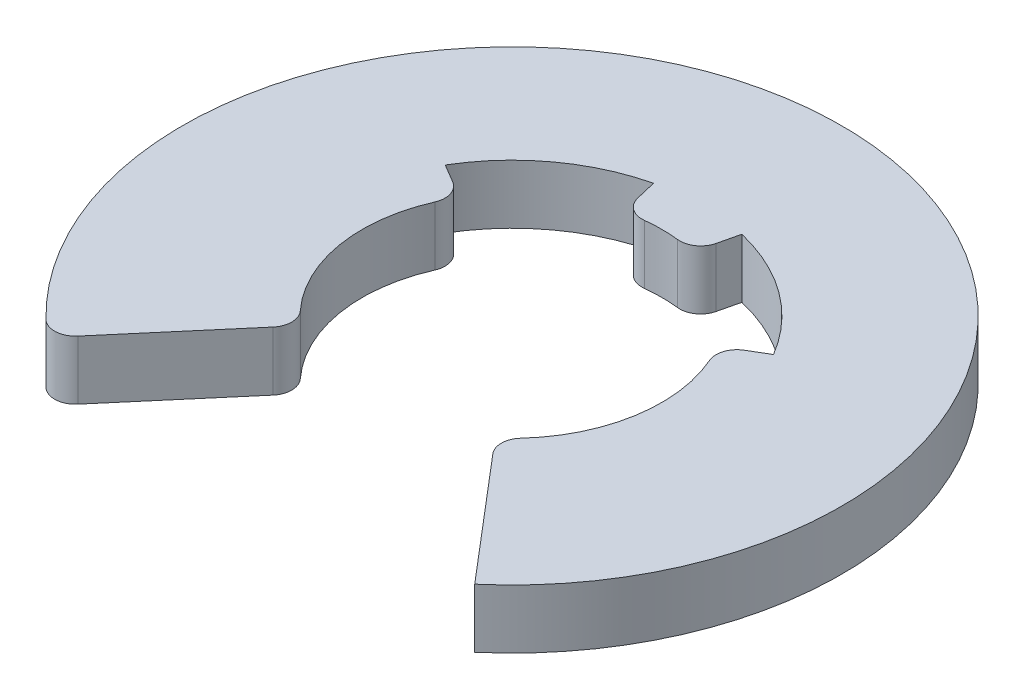
ISO-10303-21;
HEADER;
FILE_DESCRIPTION(('STEP AP214'),'2;1');
FILE_NAME('part.step','',(''),(''),'','','');
FILE_SCHEMA(('AUTOMOTIVE_DESIGN { 1 0 10303 214 1 1 1 1 }'));
ENDSEC;
DATA;
#1=APPLICATION_CONTEXT('core data for automotive mechanical design processes');
#2=APPLICATION_PROTOCOL_DEFINITION('international standard','automotive_design',2000,#1);
#3=PRODUCT_CONTEXT('',#1,'mechanical');
#4=PRODUCT('Part','Part','',(#3));
#5=PRODUCT_RELATED_PRODUCT_CATEGORY('part','',(#4));
#6=PRODUCT_DEFINITION_FORMATION('','',#4);
#7=PRODUCT_DEFINITION_CONTEXT('part definition',#1,'design');
#8=PRODUCT_DEFINITION('design','',#6,#7);
#9=PRODUCT_DEFINITION_SHAPE('','',#8);
#10=(LENGTH_UNIT() NAMED_UNIT(*) SI_UNIT(.MILLI.,.METRE.));
#11=(NAMED_UNIT(*) PLANE_ANGLE_UNIT() SI_UNIT($,.RADIAN.));
#12=(NAMED_UNIT(*) SI_UNIT($,.STERADIAN.) SOLID_ANGLE_UNIT());
#13=UNCERTAINTY_MEASURE_WITH_UNIT(LENGTH_MEASURE(1.E-05),#10,'distance_accuracy_value','');
#14=(GEOMETRIC_REPRESENTATION_CONTEXT(3) GLOBAL_UNCERTAINTY_ASSIGNED_CONTEXT((#13)) GLOBAL_UNIT_ASSIGNED_CONTEXT((#10,
#11,#12)) REPRESENTATION_CONTEXT('',''));
#15=CARTESIAN_POINT('',(0.,0.,0.));
#16=DIRECTION('',(0.,0.,1.));
#17=DIRECTION('',(1.,0.,0.));
#18=AXIS2_PLACEMENT_3D('',#15,#16,#17);
#19=CARTESIAN_POINT('',(0.,0.2125,0.));
#20=DIRECTION('',(0.,-1.,0.));
#21=DIRECTION('',(0.,0.,-1.));
#22=AXIS2_PLACEMENT_3D('',#19,#20,#21);
#23=CYLINDRICAL_SURFACE('',#22,1.375);
#24=CARTESIAN_POINT('',(0.,-0.2125,0.));
#25=DIRECTION('',(0.,-1.,0.));
#26=DIRECTION('',(0.,0.,1.));
#27=AXIS2_PLACEMENT_3D('',#24,#25,#26);
#28=CIRCLE('',#27,1.375);
#29=CARTESIAN_POINT('',(-1.18284059152493,-0.2125,-0.70107997763518));
#30=VERTEX_POINT('',#29);
#31=CARTESIAN_POINT('',(-0.318287037037037,-0.2125,-1.33765405170925));
#32=VERTEX_POINT('',#31);
#33=EDGE_CURVE('E200',#30,#32,#28,.T.);
#34=ORIENTED_EDGE('',*,*,#33,.T.);
#35=DIRECTION('',(0.,-1.,0.));
#36=VECTOR('',#35,1.);
#37=CARTESIAN_POINT('',(-0.318287037037037,0.2125,-1.33765405170925));
#38=LINE('',#37,#36);
#39=CARTESIAN_POINT('',(-0.318287037037037,0.2125,-1.33765405170925));
#40=VERTEX_POINT('',#39);
#41=EDGE_CURVE('E180',#40,#32,#38,.T.);
#42=ORIENTED_EDGE('',*,*,#41,.F.);
#43=CARTESIAN_POINT('',(0.,0.2125,0.));
#44=DIRECTION('',(0.,-1.,0.));
#45=DIRECTION('',(0.,0.,1.));
#46=AXIS2_PLACEMENT_3D('',#43,#44,#45);
#47=CIRCLE('',#46,1.375);
#48=CARTESIAN_POINT('',(-1.18284059152493,0.2125,-0.70107997763518));
#49=VERTEX_POINT('',#48);
#50=EDGE_CURVE('E187',#49,#40,#47,.T.);
#51=ORIENTED_EDGE('',*,*,#50,.F.);
#52=DIRECTION('',(0.,-1.,0.));
#53=VECTOR('',#52,1.);
#54=CARTESIAN_POINT('',(-1.18284059152493,0.2125,-0.70107997763518));
#55=LINE('',#54,#53);
#56=EDGE_CURVE('E329',#49,#30,#55,.T.);
#57=ORIENTED_EDGE('',*,*,#56,.T.);
#58=EDGE_LOOP('',(#34,#42,#51,#57));
#59=FACE_BOUND('',#58,.T.);
#60=ADVANCED_FACE('F42',(#59),#23,.F.);
#61=CARTESIAN_POINT('',(-0.318287037037037,0.2125,-1.33765405170925));
#62=DIRECTION('',(0.972839310334003,0.,-0.231481481481482));
#63=DIRECTION('',(-0.231481481481482,0.,-0.972839310334003));
#64=AXIS2_PLACEMENT_3D('',#61,#62,#63);
#65=PLANE('',#64);
#66=DIRECTION('',(0.231481481481482,0.,0.972839310334003));
#67=VECTOR('',#66,1.);
#68=CARTESIAN_POINT('',(-0.318287037037037,-0.2125,-1.33765405170925));
#69=LINE('',#68,#67);
#70=CARTESIAN_POINT('',(-0.282597082630219,-0.2125,-1.18766110018342));
#71=VERTEX_POINT('',#70);
#72=EDGE_CURVE('E413',#32,#71,#69,.T.);
#73=ORIENTED_EDGE('',*,*,#72,.T.);
#74=DIRECTION('',(0.,-1.,0.));
#75=VECTOR('',#74,1.);
#76=CARTESIAN_POINT('',(-0.282597082630219,0.2125,-1.18766110018342));
#77=LINE('',#76,#75);
#78=CARTESIAN_POINT('',(-0.282597082630219,0.2125,-1.18766110018342));
#79=VERTEX_POINT('',#78);
#80=EDGE_CURVE('E183',#71,#79,#77,.F.);
#81=ORIENTED_EDGE('',*,*,#80,.T.);
#82=DIRECTION('',(0.231481481481482,0.,0.972839310334003));
#83=VECTOR('',#82,1.);
#84=CARTESIAN_POINT('',(-0.318287037037037,0.2125,-1.33765405170925));
#85=LINE('',#84,#83);
#86=EDGE_CURVE('E175',#40,#79,#85,.T.);
#87=ORIENTED_EDGE('',*,*,#86,.F.);
#88=ORIENTED_EDGE('',*,*,#41,.T.);
#89=EDGE_LOOP('',(#73,#81,#87,#88));
#90=FACE_BOUND('',#89,.T.);
#91=ADVANCED_FACE('F178',(#90),#65,.F.);
#92=CARTESIAN_POINT('',(0.,0.2125,0.));
#93=DIRECTION('',(0.,-1.,0.));
#94=DIRECTION('',(0.,0.,-1.));
#95=AXIS2_PLACEMENT_3D('',#92,#93,#94);
#96=CYLINDRICAL_SURFACE('',#95,1.08);
#97=CARTESIAN_POINT('',(0.,-0.2125,0.));
#98=DIRECTION('',(0.,-1.,0.));
#99=DIRECTION('',(0.,0.,1.));
#100=AXIS2_PLACEMENT_3D('',#97,#98,#99);
#101=CIRCLE('',#100,1.08);
#102=CARTESIAN_POINT('',(-0.12000396826547,-0.2125,-1.0733121855269));
#103=VERTEX_POINT('',#102);
#104=CARTESIAN_POINT('',(0.12000396826547,-0.2125,-1.0733121855269));
#105=VERTEX_POINT('',#104);
#106=EDGE_CURVE('E418',#103,#105,#101,.T.);
#107=ORIENTED_EDGE('',*,*,#106,.T.);
#108=DIRECTION('',(0.,-1.,0.));
#109=VECTOR('',#108,1.);
#110=CARTESIAN_POINT('',(0.12000396826547,0.2125,-1.0733121855269));
#111=LINE('',#110,#109);
#112=CARTESIAN_POINT('',(0.12000396826547,0.2125,-1.0733121855269));
#113=VERTEX_POINT('',#112);
#114=EDGE_CURVE('E274',#105,#113,#111,.F.);
#115=ORIENTED_EDGE('',*,*,#114,.T.);
#116=CARTESIAN_POINT('',(0.,0.2125,0.));
#117=DIRECTION('',(0.,-1.,0.));
#118=DIRECTION('',(0.,0.,1.));
#119=AXIS2_PLACEMENT_3D('',#116,#117,#118);
#120=CIRCLE('',#119,1.08);
#121=CARTESIAN_POINT('',(-0.12000396826547,0.2125,-1.0733121855269));
#122=VERTEX_POINT('',#121);
#123=EDGE_CURVE('E186',#122,#113,#120,.T.);
#124=ORIENTED_EDGE('',*,*,#123,.F.);
#125=DIRECTION('',(0.,-1.,0.));
#126=VECTOR('',#125,1.);
#127=CARTESIAN_POINT('',(-0.12000396826547,0.2125,-1.0733121855269));
#128=LINE('',#127,#126);
#129=EDGE_CURVE('E270',#122,#103,#128,.T.);
#130=ORIENTED_EDGE('',*,*,#129,.T.);
#131=EDGE_LOOP('',(#107,#115,#124,#130));
#132=FACE_BOUND('',#131,.T.);
#133=ADVANCED_FACE('F386',(#132),#96,.F.);
#134=CARTESIAN_POINT('',(0.318287037037037,0.2125,-1.33765405170925));
#135=DIRECTION('',(-0.972839310334003,0.,-0.231481481481482));
#136=DIRECTION('',(-0.231481481481482,0.,0.972839310334003));
#137=AXIS2_PLACEMENT_3D('',#134,#135,#136);
#138=PLANE('',#137);
#139=DIRECTION('',(0.231481481481482,0.,-0.972839310334003));
#140=VECTOR('',#139,1.);
#141=CARTESIAN_POINT('',(0.318287037037037,0.2125,-1.33765405170925));
#142=LINE('',#141,#140);
#143=CARTESIAN_POINT('',(0.282597082630219,0.2125,-1.18766110018342));
#144=VERTEX_POINT('',#143);
#145=CARTESIAN_POINT('',(0.318287037037037,0.2125,-1.33765405170925));
#146=VERTEX_POINT('',#145);
#147=EDGE_CURVE('E433',#144,#146,#142,.T.);
#148=ORIENTED_EDGE('',*,*,#147,.F.);
#149=DIRECTION('',(0.,-1.,0.));
#150=VECTOR('',#149,1.);
#151=CARTESIAN_POINT('',(0.282597082630219,0.2125,-1.18766110018342));
#152=LINE('',#151,#150);
#153=CARTESIAN_POINT('',(0.282597082630219,-0.2125,-1.18766110018342));
#154=VERTEX_POINT('',#153);
#155=EDGE_CURVE('E266',#144,#154,#152,.T.);
#156=ORIENTED_EDGE('',*,*,#155,.T.);
#157=DIRECTION('',(0.231481481481482,0.,-0.972839310334003));
#158=VECTOR('',#157,1.);
#159=CARTESIAN_POINT('',(0.318287037037037,-0.2125,-1.33765405170925));
#160=LINE('',#159,#158);
#161=CARTESIAN_POINT('',(0.318287037037037,-0.2125,-1.33765405170925));
#162=VERTEX_POINT('',#161);
#163=EDGE_CURVE('E361',#154,#162,#160,.T.);
#164=ORIENTED_EDGE('',*,*,#163,.T.);
#165=DIRECTION('',(0.,-1.,0.));
#166=VECTOR('',#165,1.);
#167=CARTESIAN_POINT('',(0.318287037037037,0.2125,-1.33765405170925));
#168=LINE('',#167,#166);
#169=EDGE_CURVE('E203',#146,#162,#168,.T.);
#170=ORIENTED_EDGE('',*,*,#169,.F.);
#171=EDGE_LOOP('',(#148,#156,#164,#170));
#172=FACE_BOUND('',#171,.T.);
#173=ADVANCED_FACE('F429',(#172),#138,.F.);
#174=CARTESIAN_POINT('',(0.,0.2125,0.));
#175=DIRECTION('',(0.,-1.,0.));
#176=DIRECTION('',(0.,0.,-1.));
#177=AXIS2_PLACEMENT_3D('',#174,#175,#176);
#178=CYLINDRICAL_SURFACE('',#177,1.375);
#179=CARTESIAN_POINT('',(0.,-0.2125,0.));
#180=DIRECTION('',(0.,-1.,0.));
#181=DIRECTION('',(0.,0.,1.));
#182=AXIS2_PLACEMENT_3D('',#179,#180,#181);
#183=CIRCLE('',#182,1.375);
#184=CARTESIAN_POINT('',(1.18284059152493,-0.2125,-0.70107997763518));
#185=VERTEX_POINT('',#184);
#186=EDGE_CURVE('E351',#162,#185,#183,.T.);
#187=ORIENTED_EDGE('',*,*,#186,.T.);
#188=DIRECTION('',(0.,-1.,0.));
#189=VECTOR('',#188,1.);
#190=CARTESIAN_POINT('',(1.18284059152493,0.2125,-0.70107997763518));
#191=LINE('',#190,#189);
#192=CARTESIAN_POINT('',(1.18284059152493,0.2125,-0.70107997763518));
#193=VERTEX_POINT('',#192);
#194=EDGE_CURVE('E213',#193,#185,#191,.T.);
#195=ORIENTED_EDGE('',*,*,#194,.F.);
#196=CARTESIAN_POINT('',(0.,0.2125,0.));
#197=DIRECTION('',(0.,-1.,0.));
#198=DIRECTION('',(0.,0.,1.));
#199=AXIS2_PLACEMENT_3D('',#196,#197,#198);
#200=CIRCLE('',#199,1.375);
#201=EDGE_CURVE('E432',#146,#193,#200,.T.);
#202=ORIENTED_EDGE('',*,*,#201,.F.);
#203=ORIENTED_EDGE('',*,*,#169,.T.);
#204=EDGE_LOOP('',(#187,#195,#202,#203));
#205=FACE_BOUND('',#204,.T.);
#206=ADVANCED_FACE('F431',(#205),#178,.F.);
#207=CARTESIAN_POINT('',(1.18284059152493,0.2125,-0.70107997763518));
#208=DIRECTION('',(0.509876347371041,0.,0.860247702927224));
#209=DIRECTION('',(0.860247702927224,0.,-0.509876347371041));
#210=AXIS2_PLACEMENT_3D('',#207,#208,#209);
#211=PLANE('',#210);
#212=DIRECTION('',(-0.860247702927224,0.,0.509876347371041));
#213=VECTOR('',#212,1.);
#214=CARTESIAN_POINT('',(1.18284059152493,-0.2125,-0.70107997763518));
#215=LINE('',#214,#213);
#216=CARTESIAN_POINT('',(1.05020708192603,-0.2125,-0.62246693492298));
#217=VERTEX_POINT('',#216);
#218=EDGE_CURVE('E343',#185,#217,#215,.T.);
#219=ORIENTED_EDGE('',*,*,#218,.T.);
#220=DIRECTION('',(0.,-1.,0.));
#221=VECTOR('',#220,1.);
#222=CARTESIAN_POINT('',(1.05020708192603,0.2125,-0.62246693492298));
#223=LINE('',#222,#221);
#224=CARTESIAN_POINT('',(1.05020708192603,0.2125,-0.62246693492298));
#225=VERTEX_POINT('',#224);
#226=EDGE_CURVE('E263',#217,#225,#223,.F.);
#227=ORIENTED_EDGE('',*,*,#226,.T.);
#228=DIRECTION('',(-0.860247702927224,0.,0.509876347371041));
#229=VECTOR('',#228,1.);
#230=CARTESIAN_POINT('',(1.18284059152493,0.2125,-0.70107997763518));
#231=LINE('',#230,#229);
#232=EDGE_CURVE('E346',#193,#225,#231,.T.);
#233=ORIENTED_EDGE('',*,*,#232,.F.);
#234=ORIENTED_EDGE('',*,*,#194,.T.);
#235=EDGE_LOOP('',(#219,#227,#233,#234));
#236=FACE_BOUND('',#235,.T.);
#237=ADVANCED_FACE('F342',(#236),#211,.F.);
#238=CARTESIAN_POINT('',(0.,0.2125,0.));
#239=DIRECTION('',(0.,-1.,0.));
#240=DIRECTION('',(0.,0.,-1.));
#241=AXIS2_PLACEMENT_3D('',#238,#239,#240);
#242=CYLINDRICAL_SURFACE('',#241,1.08);
#243=CARTESIAN_POINT('',(0.,-0.2125,0.));
#244=DIRECTION('',(0.,-1.,0.));
#245=DIRECTION('',(0.,0.,1.));
#246=AXIS2_PLACEMENT_3D('',#243,#244,#245);
#247=CIRCLE('',#246,1.08);
#248=CARTESIAN_POINT('',(0.989287493296116,-0.2125,-0.433255416132201));
#249=VERTEX_POINT('',#248);
#250=CARTESIAN_POINT('',(0.795072267515038,-0.2125,0.730930974462361));
#251=VERTEX_POINT('',#250);
#252=EDGE_CURVE('E354',#249,#251,#247,.T.);
#253=ORIENTED_EDGE('',*,*,#252,.T.);
#254=DIRECTION('',(0.,-1.,0.));
#255=VECTOR('',#254,1.);
#256=CARTESIAN_POINT('',(0.795072267515038,0.2125,0.730930974462361));
#257=LINE('',#256,#255);
#258=CARTESIAN_POINT('',(0.795072267515038,0.2125,0.730930974462361));
#259=VERTEX_POINT('',#258);
#260=EDGE_CURVE('E240',#251,#259,#257,.F.);
#261=ORIENTED_EDGE('',*,*,#260,.T.);
#262=CARTESIAN_POINT('',(0.,0.2125,0.));
#263=DIRECTION('',(0.,-1.,0.));
#264=DIRECTION('',(0.,0.,1.));
#265=AXIS2_PLACEMENT_3D('',#262,#263,#264);
#266=CIRCLE('',#265,1.08);
#267=CARTESIAN_POINT('',(0.989287493296116,0.2125,-0.433255416132201));
#268=VERTEX_POINT('',#267);
#269=EDGE_CURVE('E435',#268,#259,#266,.T.);
#270=ORIENTED_EDGE('',*,*,#269,.F.);
#271=DIRECTION('',(0.,-1.,0.));
#272=VECTOR('',#271,1.);
#273=CARTESIAN_POINT('',(0.989287493296116,0.2125,-0.433255416132201));
#274=LINE('',#273,#272);
#275=EDGE_CURVE('E236',#268,#249,#274,.T.);
#276=ORIENTED_EDGE('',*,*,#275,.T.);
#277=EDGE_LOOP('',(#253,#261,#270,#276));
#278=FACE_BOUND('',#277,.T.);
#279=ADVANCED_FACE('F455',(#278),#242,.F.);
#280=CARTESIAN_POINT('',(1.53935185185185,0.2125,1.8085963828893));
#281=DIRECTION('',(0.761514266479707,0.,-0.648148148148148));
#282=DIRECTION('',(-0.648148148148148,0.,-0.761514266479707));
#283=AXIS2_PLACEMENT_3D('',#280,#281,#282);
#284=PLANE('',#283);
#285=DIRECTION('',(0.648148148148148,0.,0.761514266479707));
#286=VECTOR('',#285,1.);
#287=CARTESIAN_POINT('',(1.53935185185185,0.2125,1.8085963828893));
#288=LINE('',#287,#286);
#289=CARTESIAN_POINT('',(0.791271831364614,0.2125,0.929671387582133));
#290=VERTEX_POINT('',#289);
#291=CARTESIAN_POINT('',(1.53935185185185,0.2125,1.8085963828893));
#292=VERTEX_POINT('',#291);
#293=EDGE_CURVE('E443',#290,#292,#288,.T.);
#294=ORIENTED_EDGE('',*,*,#293,.F.);
#295=DIRECTION('',(0.,-1.,0.));
#296=VECTOR('',#295,1.);
#297=CARTESIAN_POINT('',(0.791271831364614,0.2125,0.929671387582133));
#298=LINE('',#297,#296);
#299=CARTESIAN_POINT('',(0.791271831364614,-0.2125,0.929671387582133));
#300=VERTEX_POINT('',#299);
#301=EDGE_CURVE('E202',#290,#300,#298,.T.);
#302=ORIENTED_EDGE('',*,*,#301,.T.);
#303=DIRECTION('',(0.648148148148148,0.,0.761514266479707));
#304=VECTOR('',#303,1.);
#305=CARTESIAN_POINT('',(1.53935185185185,-0.2125,1.8085963828893));
#306=LINE('',#305,#304);
#307=CARTESIAN_POINT('',(1.53935185185185,-0.2125,1.8085963828893));
#308=VERTEX_POINT('',#307);
#309=EDGE_CURVE('E358',#300,#308,#306,.T.);
#310=ORIENTED_EDGE('',*,*,#309,.T.);
#311=DIRECTION('',(0.,-1.,0.));
#312=VECTOR('',#311,1.);
#313=CARTESIAN_POINT('',(1.53935185185185,0.2125,1.8085963828893));
#314=LINE('',#313,#312);
#315=EDGE_CURVE('E332',#292,#308,#314,.T.);
#316=ORIENTED_EDGE('',*,*,#315,.F.);
#317=EDGE_LOOP('',(#294,#302,#310,#316));
#318=FACE_BOUND('',#317,.T.);
#319=ADVANCED_FACE('F452',(#318),#284,.F.);
#320=CARTESIAN_POINT('',(0.,0.2125,0.));
#321=DIRECTION('',(0.,-1.,0.));
#322=DIRECTION('',(0.,0.,-1.));
#323=AXIS2_PLACEMENT_3D('',#320,#321,#322);
#324=CYLINDRICAL_SURFACE('',#323,2.375);
#325=CARTESIAN_POINT('',(0.,-0.2125,0.));
#326=DIRECTION('',(0.,1.,0.));
#327=DIRECTION('',(0.,0.,1.));
#328=AXIS2_PLACEMENT_3D('',#325,#326,#327);
#329=CIRCLE('',#328,2.375);
#330=CARTESIAN_POINT('',(-1.65777762897793,-0.2125,1.70070524573199));
#331=VERTEX_POINT('',#330);
#332=EDGE_CURVE('E325',#308,#331,#329,.T.);
#333=ORIENTED_EDGE('',*,*,#332,.T.);
#334=DIRECTION('',(0.,-1.,0.));
#335=VECTOR('',#334,1.);
#336=CARTESIAN_POINT('',(-1.65777762897793,0.2125,1.70070524573199));
#337=LINE('',#336,#335);
#338=CARTESIAN_POINT('',(-1.65777762897793,0.2125,1.70070524573199));
#339=VERTEX_POINT('',#338);
#340=EDGE_CURVE('E11',#331,#339,#337,.F.);
#341=ORIENTED_EDGE('',*,*,#340,.T.);
#342=CARTESIAN_POINT('',(0.,0.2125,0.));
#343=DIRECTION('',(0.,1.,0.));
#344=DIRECTION('',(0.,0.,1.));
#345=AXIS2_PLACEMENT_3D('',#342,#343,#344);
#346=CIRCLE('',#345,2.375);
#347=EDGE_CURVE('E309',#292,#339,#346,.T.);
#348=ORIENTED_EDGE('',*,*,#347,.F.);
#349=ORIENTED_EDGE('',*,*,#315,.T.);
#350=EDGE_LOOP('',(#333,#341,#348,#349));
#351=FACE_BOUND('',#350,.T.);
#352=ADVANCED_FACE('F372',(#351),#324,.T.);
#353=CARTESIAN_POINT('',(-1.53935185185185,0.2125,1.8085963828893));
#354=DIRECTION('',(-0.761514266479707,0.,-0.648148148148148));
#355=DIRECTION('',(-0.648148148148148,0.,0.761514266479707));
#356=AXIS2_PLACEMENT_3D('',#353,#354,#355);
#357=PLANE('',#356);
#358=DIRECTION('',(0.648148148148148,0.,-0.761514266479707));
#359=VECTOR('',#358,1.);
#360=CARTESIAN_POINT('',(-1.53935185185185,-0.2125,1.8085963828893));
#361=LINE('',#360,#359);
#362=CARTESIAN_POINT('',(-1.43884874401789,-0.2125,1.69051450506588));
#363=VERTEX_POINT('',#362);
#364=CARTESIAN_POINT('',(-0.791271831364614,-0.2125,0.929671387582133));
#365=VERTEX_POINT('',#364);
#366=EDGE_CURVE('E302',#363,#365,#361,.T.);
#367=ORIENTED_EDGE('',*,*,#366,.T.);
#368=DIRECTION('',(0.,-1.,0.));
#369=VECTOR('',#368,1.);
#370=CARTESIAN_POINT('',(-0.791271831364614,0.2125,0.929671387582133));
#371=LINE('',#370,#369);
#372=CARTESIAN_POINT('',(-0.791271831364614,0.2125,0.929671387582133));
#373=VERTEX_POINT('',#372);
#374=EDGE_CURVE('E51',#365,#373,#371,.F.);
#375=ORIENTED_EDGE('',*,*,#374,.T.);
#376=DIRECTION('',(0.648148148148148,0.,-0.761514266479707));
#377=VECTOR('',#376,1.);
#378=CARTESIAN_POINT('',(-1.53935185185185,0.2125,1.8085963828893));
#379=LINE('',#378,#377);
#380=CARTESIAN_POINT('',(-1.43884874401789,0.2125,1.69051450506588));
#381=VERTEX_POINT('',#380);
#382=EDGE_CURVE('E299',#381,#373,#379,.T.);
#383=ORIENTED_EDGE('',*,*,#382,.F.);
#384=DIRECTION('',(0.,-1.,0.));
#385=VECTOR('',#384,1.);
#386=CARTESIAN_POINT('',(-1.43884874401789,0.2125,1.69051450506588));
#387=LINE('',#386,#385);
#388=EDGE_CURVE('E289',#381,#363,#387,.T.);
#389=ORIENTED_EDGE('',*,*,#388,.T.);
#390=EDGE_LOOP('',(#367,#375,#383,#389));
#391=FACE_BOUND('',#390,.T.);
#392=ADVANCED_FACE('F298',(#391),#357,.F.);
#393=CARTESIAN_POINT('',(0.,0.2125,0.));
#394=DIRECTION('',(0.,-1.,0.));
#395=DIRECTION('',(0.,0.,-1.));
#396=AXIS2_PLACEMENT_3D('',#393,#394,#395);
#397=CYLINDRICAL_SURFACE('',#396,1.08);
#398=CARTESIAN_POINT('',(0.,-0.2125,0.));
#399=DIRECTION('',(0.,-1.,0.));
#400=DIRECTION('',(0.,0.,1.));
#401=AXIS2_PLACEMENT_3D('',#398,#399,#400);
#402=CIRCLE('',#401,1.08);
#403=CARTESIAN_POINT('',(-0.795072267515038,-0.2125,0.730930974462361));
#404=VERTEX_POINT('',#403);
#405=CARTESIAN_POINT('',(-0.989287493296116,-0.2125,-0.433255416132201));
#406=VERTEX_POINT('',#405);
#407=EDGE_CURVE('E315',#404,#406,#402,.T.);
#408=ORIENTED_EDGE('',*,*,#407,.T.);
#409=DIRECTION('',(0.,-1.,0.));
#410=VECTOR('',#409,1.);
#411=CARTESIAN_POINT('',(-0.989287493296116,0.2125,-0.433255416132201));
#412=LINE('',#411,#410);
#413=CARTESIAN_POINT('',(-0.989287493296116,0.2125,-0.433255416132201));
#414=VERTEX_POINT('',#413);
#415=EDGE_CURVE('E66',#406,#414,#412,.F.);
#416=ORIENTED_EDGE('',*,*,#415,.T.);
#417=CARTESIAN_POINT('',(0.,0.2125,0.));
#418=DIRECTION('',(0.,-1.,0.));
#419=DIRECTION('',(0.,0.,1.));
#420=AXIS2_PLACEMENT_3D('',#417,#418,#419);
#421=CIRCLE('',#420,1.08);
#422=CARTESIAN_POINT('',(-0.795072267515038,0.2125,0.730930974462361));
#423=VERTEX_POINT('',#422);
#424=EDGE_CURVE('E308',#423,#414,#421,.T.);
#425=ORIENTED_EDGE('',*,*,#424,.F.);
#426=DIRECTION('',(0.,-1.,0.));
#427=VECTOR('',#426,1.);
#428=CARTESIAN_POINT('',(-0.795072267515038,0.2125,0.730930974462361));
#429=LINE('',#428,#427);
#430=EDGE_CURVE('E283',#423,#404,#429,.T.);
#431=ORIENTED_EDGE('',*,*,#430,.T.);
#432=EDGE_LOOP('',(#408,#416,#425,#431));
#433=FACE_BOUND('',#432,.T.);
#434=ADVANCED_FACE('F314',(#433),#397,.F.);
#435=CARTESIAN_POINT('',(-1.18284059152493,0.2125,-0.70107997763518));
#436=DIRECTION('',(-0.509876347371041,0.,0.860247702927224));
#437=DIRECTION('',(0.860247702927224,0.,0.509876347371041));
#438=AXIS2_PLACEMENT_3D('',#435,#436,#437);
#439=PLANE('',#438);
#440=DIRECTION('',(-0.860247702927224,0.,-0.509876347371041));
#441=VECTOR('',#440,1.);
#442=CARTESIAN_POINT('',(-1.18284059152493,0.2125,-0.70107997763518));
#443=LINE('',#442,#441);
#444=CARTESIAN_POINT('',(-1.05020708192603,0.2125,-0.62246693492298));
#445=VERTEX_POINT('',#444);
#446=EDGE_CURVE('E192',#445,#49,#443,.T.);
#447=ORIENTED_EDGE('',*,*,#446,.F.);
#448=DIRECTION('',(0.,-1.,0.));
#449=VECTOR('',#448,1.);
#450=CARTESIAN_POINT('',(-1.05020708192603,0.2125,-0.62246693492298));
#451=LINE('',#450,#449);
#452=CARTESIAN_POINT('',(-1.05020708192603,-0.2125,-0.62246693492298));
#453=VERTEX_POINT('',#452);
#454=EDGE_CURVE('E279',#445,#453,#451,.T.);
#455=ORIENTED_EDGE('',*,*,#454,.T.);
#456=DIRECTION('',(-0.860247702927224,0.,-0.509876347371041));
#457=VECTOR('',#456,1.);
#458=CARTESIAN_POINT('',(-1.18284059152493,-0.2125,-0.70107997763518));
#459=LINE('',#458,#457);
#460=EDGE_CURVE('E197',#453,#30,#459,.T.);
#461=ORIENTED_EDGE('',*,*,#460,.T.);
#462=ORIENTED_EDGE('',*,*,#56,.F.);
#463=EDGE_LOOP('',(#447,#455,#461,#462));
#464=FACE_BOUND('',#463,.T.);
#465=ADVANCED_FACE('F412',(#464),#439,.F.);
#466=CARTESIAN_POINT('',(0.,0.2125,0.));
#467=DIRECTION('',(0.,1.,0.));
#468=DIRECTION('',(0.,0.,1.));
#469=AXIS2_PLACEMENT_3D('',#466,#467,#468);
#470=PLANE('',#469);
#471=ORIENTED_EDGE('',*,*,#269,.T.);
#472=CARTESIAN_POINT('',(0.90549897133657,0.2125,0.832449165359911));
#473=DIRECTION('',(0.,1.,0.));
#474=DIRECTION('',(0.,0.,1.));
#475=AXIS2_PLACEMENT_3D('',#472,#473,#474);
#476=CIRCLE('',#475,0.15);
#477=EDGE_CURVE('E260',#259,#290,#476,.T.);
#478=ORIENTED_EDGE('',*,*,#477,.T.);
#479=ORIENTED_EDGE('',*,*,#293,.T.);
#480=ORIENTED_EDGE('',*,*,#347,.T.);
#481=CARTESIAN_POINT('',(-1.55307588398985,0.2125,1.59329228284366));
#482=DIRECTION('',(0.,1.,0.));
#483=DIRECTION('',(0.,0.,1.));
#484=AXIS2_PLACEMENT_3D('',#481,#482,#483);
#485=CIRCLE('',#484,0.15);
#486=EDGE_CURVE('E243',#339,#381,#485,.T.);
#487=ORIENTED_EDGE('',*,*,#486,.T.);
#488=ORIENTED_EDGE('',*,*,#382,.T.);
#489=CARTESIAN_POINT('',(-0.90549897133657,0.2125,0.832449165359911));
#490=DIRECTION('',(0.,1.,0.));
#491=DIRECTION('',(0.,0.,1.));
#492=AXIS2_PLACEMENT_3D('',#489,#490,#491);
#493=CIRCLE('',#492,0.15);
#494=EDGE_CURVE('E246',#373,#423,#493,.T.);
#495=ORIENTED_EDGE('',*,*,#494,.T.);
#496=ORIENTED_EDGE('',*,*,#424,.T.);
#497=CARTESIAN_POINT('',(-1.12668853403169,0.2125,-0.493429779483896));
#498=DIRECTION('',(0.,1.,0.));
#499=DIRECTION('',(0.,0.,1.));
#500=AXIS2_PLACEMENT_3D('',#497,#498,#499);
#501=CIRCLE('',#500,0.15);
#502=EDGE_CURVE('E58',#414,#445,#501,.T.);
#503=ORIENTED_EDGE('',*,*,#502,.T.);
#504=ORIENTED_EDGE('',*,*,#446,.T.);
#505=ORIENTED_EDGE('',*,*,#50,.T.);
#506=ORIENTED_EDGE('',*,*,#86,.T.);
#507=CARTESIAN_POINT('',(-0.136671186080119,0.2125,-1.22238332240564));
#508=DIRECTION('',(0.,1.,0.));
#509=DIRECTION('',(0.,0.,1.));
#510=AXIS2_PLACEMENT_3D('',#507,#508,#509);
#511=CIRCLE('',#510,0.15);
#512=EDGE_CURVE('E251',#79,#122,#511,.T.);
#513=ORIENTED_EDGE('',*,*,#512,.T.);
#514=ORIENTED_EDGE('',*,*,#123,.T.);
#515=CARTESIAN_POINT('',(0.136671186080119,0.2125,-1.22238332240564));
#516=DIRECTION('',(0.,1.,0.));
#517=DIRECTION('',(0.,0.,1.));
#518=AXIS2_PLACEMENT_3D('',#515,#516,#517);
#519=CIRCLE('',#518,0.15);
#520=EDGE_CURVE('E254',#113,#144,#519,.T.);
#521=ORIENTED_EDGE('',*,*,#520,.T.);
#522=ORIENTED_EDGE('',*,*,#147,.T.);
#523=ORIENTED_EDGE('',*,*,#201,.T.);
#524=ORIENTED_EDGE('',*,*,#232,.T.);
#525=CARTESIAN_POINT('',(1.12668853403169,0.2125,-0.493429779483896));
#526=DIRECTION('',(0.,1.,0.));
#527=DIRECTION('',(0.,0.,1.));
#528=AXIS2_PLACEMENT_3D('',#525,#526,#527);
#529=CIRCLE('',#528,0.15);
#530=EDGE_CURVE('E257',#225,#268,#529,.T.);
#531=ORIENTED_EDGE('',*,*,#530,.T.);
#532=EDGE_LOOP('',(#471,#478,#479,#480,#487,#488,#495,#496,#503,#504,#505,#506,#513,#514,#521,
#522,#523,#524,#531));
#533=FACE_BOUND('',#532,.T.);
#534=ADVANCED_FACE('F191',(#533),#470,.T.);
#535=CARTESIAN_POINT('',(0.,-0.2125,0.));
#536=DIRECTION('',(0.,1.,0.));
#537=DIRECTION('',(0.,0.,1.));
#538=AXIS2_PLACEMENT_3D('',#535,#536,#537);
#539=PLANE('',#538);
#540=ORIENTED_EDGE('',*,*,#309,.F.);
#541=CARTESIAN_POINT('',(0.90549897133657,-0.2125,0.832449165359911));
#542=DIRECTION('',(0.,1.,0.));
#543=DIRECTION('',(0.,0.,1.));
#544=AXIS2_PLACEMENT_3D('',#541,#542,#543);
#545=CIRCLE('',#544,0.15);
#546=EDGE_CURVE('E233',#300,#251,#545,.F.);
#547=ORIENTED_EDGE('',*,*,#546,.T.);
#548=ORIENTED_EDGE('',*,*,#252,.F.);
#549=CARTESIAN_POINT('',(1.12668853403169,-0.2125,-0.493429779483896));
#550=DIRECTION('',(0.,1.,0.));
#551=DIRECTION('',(0.,0.,1.));
#552=AXIS2_PLACEMENT_3D('',#549,#550,#551);
#553=CIRCLE('',#552,0.15);
#554=EDGE_CURVE('E230',#249,#217,#553,.F.);
#555=ORIENTED_EDGE('',*,*,#554,.T.);
#556=ORIENTED_EDGE('',*,*,#218,.F.);
#557=ORIENTED_EDGE('',*,*,#186,.F.);
#558=ORIENTED_EDGE('',*,*,#163,.F.);
#559=CARTESIAN_POINT('',(0.136671186080119,-0.2125,-1.22238332240564));
#560=DIRECTION('',(0.,1.,0.));
#561=DIRECTION('',(0.,0.,1.));
#562=AXIS2_PLACEMENT_3D('',#559,#560,#561);
#563=CIRCLE('',#562,0.15);
#564=EDGE_CURVE('E227',#154,#105,#563,.F.);
#565=ORIENTED_EDGE('',*,*,#564,.T.);
#566=ORIENTED_EDGE('',*,*,#106,.F.);
#567=CARTESIAN_POINT('',(-0.136671186080119,-0.2125,-1.22238332240564));
#568=DIRECTION('',(0.,1.,0.));
#569=DIRECTION('',(0.,0.,1.));
#570=AXIS2_PLACEMENT_3D('',#567,#568,#569);
#571=CIRCLE('',#570,0.15);
#572=EDGE_CURVE('E224',#103,#71,#571,.F.);
#573=ORIENTED_EDGE('',*,*,#572,.T.);
#574=ORIENTED_EDGE('',*,*,#72,.F.);
#575=ORIENTED_EDGE('',*,*,#33,.F.);
#576=ORIENTED_EDGE('',*,*,#460,.F.);
#577=CARTESIAN_POINT('',(-1.12668853403169,-0.2125,-0.493429779483896));
#578=DIRECTION('',(0.,1.,0.));
#579=DIRECTION('',(0.,0.,1.));
#580=AXIS2_PLACEMENT_3D('',#577,#578,#579);
#581=CIRCLE('',#580,0.15);
#582=EDGE_CURVE('E222',#453,#406,#581,.F.);
#583=ORIENTED_EDGE('',*,*,#582,.T.);
#584=ORIENTED_EDGE('',*,*,#407,.F.);
#585=CARTESIAN_POINT('',(-0.90549897133657,-0.2125,0.832449165359911));
#586=DIRECTION('',(0.,1.,0.));
#587=DIRECTION('',(0.,0.,1.));
#588=AXIS2_PLACEMENT_3D('',#585,#586,#587);
#589=CIRCLE('',#588,0.15);
#590=EDGE_CURVE('E219',#404,#365,#589,.F.);
#591=ORIENTED_EDGE('',*,*,#590,.T.);
#592=ORIENTED_EDGE('',*,*,#366,.F.);
#593=CARTESIAN_POINT('',(-1.55307588398985,-0.2125,1.59329228284366));
#594=DIRECTION('',(0.,1.,0.));
#595=DIRECTION('',(0.,0.,1.));
#596=AXIS2_PLACEMENT_3D('',#593,#594,#595);
#597=CIRCLE('',#596,0.15);
#598=EDGE_CURVE('E209',#363,#331,#597,.F.);
#599=ORIENTED_EDGE('',*,*,#598,.T.);
#600=ORIENTED_EDGE('',*,*,#332,.F.);
#601=EDGE_LOOP('',(#540,#547,#548,#555,#556,#557,#558,#565,#566,#573,#574,#575,#576,#583,#584,
#591,#592,#599,#600));
#602=FACE_BOUND('',#601,.T.);
#603=ADVANCED_FACE('F318',(#602),#539,.F.);
#604=CARTESIAN_POINT('',(0.90549897133657,0.2125,0.832449165359911));
#605=DIRECTION('',(0.,-1.,0.));
#606=DIRECTION('',(0.,0.,-1.));
#607=AXIS2_PLACEMENT_3D('',#604,#605,#606);
#608=CYLINDRICAL_SURFACE('',#607,0.15);
#609=ORIENTED_EDGE('',*,*,#477,.F.);
#610=ORIENTED_EDGE('',*,*,#260,.F.);
#611=ORIENTED_EDGE('',*,*,#546,.F.);
#612=ORIENTED_EDGE('',*,*,#301,.F.);
#613=EDGE_LOOP('',(#609,#610,#611,#612));
#614=FACE_BOUND('',#613,.T.);
#615=ADVANCED_FACE('F390',(#614),#608,.T.);
#616=CARTESIAN_POINT('',(1.12668853403169,0.2125,-0.493429779483896));
#617=DIRECTION('',(0.,-1.,0.));
#618=DIRECTION('',(0.,0.,-1.));
#619=AXIS2_PLACEMENT_3D('',#616,#617,#618);
#620=CYLINDRICAL_SURFACE('',#619,0.15);
#621=ORIENTED_EDGE('',*,*,#530,.F.);
#622=ORIENTED_EDGE('',*,*,#226,.F.);
#623=ORIENTED_EDGE('',*,*,#554,.F.);
#624=ORIENTED_EDGE('',*,*,#275,.F.);
#625=EDGE_LOOP('',(#621,#622,#623,#624));
#626=FACE_BOUND('',#625,.T.);
#627=ADVANCED_FACE('F393',(#626),#620,.T.);
#628=CARTESIAN_POINT('',(0.136671186080119,0.2125,-1.22238332240564));
#629=DIRECTION('',(0.,-1.,0.));
#630=DIRECTION('',(0.,0.,-1.));
#631=AXIS2_PLACEMENT_3D('',#628,#629,#630);
#632=CYLINDRICAL_SURFACE('',#631,0.15);
#633=ORIENTED_EDGE('',*,*,#520,.F.);
#634=ORIENTED_EDGE('',*,*,#114,.F.);
#635=ORIENTED_EDGE('',*,*,#564,.F.);
#636=ORIENTED_EDGE('',*,*,#155,.F.);
#637=EDGE_LOOP('',(#633,#634,#635,#636));
#638=FACE_BOUND('',#637,.T.);
#639=ADVANCED_FACE('F397',(#638),#632,.T.);
#640=CARTESIAN_POINT('',(-0.136671186080119,0.2125,-1.22238332240564));
#641=DIRECTION('',(0.,-1.,0.));
#642=DIRECTION('',(0.,0.,-1.));
#643=AXIS2_PLACEMENT_3D('',#640,#641,#642);
#644=CYLINDRICAL_SURFACE('',#643,0.15);
#645=ORIENTED_EDGE('',*,*,#512,.F.);
#646=ORIENTED_EDGE('',*,*,#80,.F.);
#647=ORIENTED_EDGE('',*,*,#572,.F.);
#648=ORIENTED_EDGE('',*,*,#129,.F.);
#649=EDGE_LOOP('',(#645,#646,#647,#648));
#650=FACE_BOUND('',#649,.T.);
#651=ADVANCED_FACE('F401',(#650),#644,.T.);
#652=CARTESIAN_POINT('',(-1.12668853403169,0.2125,-0.493429779483896));
#653=DIRECTION('',(0.,-1.,0.));
#654=DIRECTION('',(0.,0.,-1.));
#655=AXIS2_PLACEMENT_3D('',#652,#653,#654);
#656=CYLINDRICAL_SURFACE('',#655,0.15);
#657=ORIENTED_EDGE('',*,*,#502,.F.);
#658=ORIENTED_EDGE('',*,*,#415,.F.);
#659=ORIENTED_EDGE('',*,*,#582,.F.);
#660=ORIENTED_EDGE('',*,*,#454,.F.);
#661=EDGE_LOOP('',(#657,#658,#659,#660));
#662=FACE_BOUND('',#661,.T.);
#663=ADVANCED_FACE('F380',(#662),#656,.T.);
#664=CARTESIAN_POINT('',(-0.90549897133657,0.2125,0.832449165359911));
#665=DIRECTION('',(0.,-1.,0.));
#666=DIRECTION('',(0.,0.,-1.));
#667=AXIS2_PLACEMENT_3D('',#664,#665,#666);
#668=CYLINDRICAL_SURFACE('',#667,0.15);
#669=ORIENTED_EDGE('',*,*,#494,.F.);
#670=ORIENTED_EDGE('',*,*,#374,.F.);
#671=ORIENTED_EDGE('',*,*,#590,.F.);
#672=ORIENTED_EDGE('',*,*,#430,.F.);
#673=EDGE_LOOP('',(#669,#670,#671,#672));
#674=FACE_BOUND('',#673,.T.);
#675=ADVANCED_FACE('F312',(#674),#668,.T.);
#676=CARTESIAN_POINT('',(-1.55307588398985,0.2125,1.59329228284366));
#677=DIRECTION('',(0.,-1.,0.));
#678=DIRECTION('',(0.,0.,-1.));
#679=AXIS2_PLACEMENT_3D('',#676,#677,#678);
#680=CYLINDRICAL_SURFACE('',#679,0.15);
#681=ORIENTED_EDGE('',*,*,#486,.F.);
#682=ORIENTED_EDGE('',*,*,#340,.F.);
#683=ORIENTED_EDGE('',*,*,#598,.F.);
#684=ORIENTED_EDGE('',*,*,#388,.F.);
#685=EDGE_LOOP('',(#681,#682,#683,#684));
#686=FACE_BOUND('',#685,.T.);
#687=ADVANCED_FACE('F44',(#686),#680,.T.);
#688=CLOSED_SHELL('',(#60,#91,#133,#173,#206,#237,#279,#319,#352,#392,#434,#465,#534,#603,#615,
#627,#639,#651,#663,#675,#687));
#689=MANIFOLD_SOLID_BREP('B2',#688);
#690=ADVANCED_BREP_SHAPE_REPRESENTATION('',(#18,#689),#14);
#691=SHAPE_DEFINITION_REPRESENTATION(#9,#690);
ENDSEC;
END-ISO-10303-21;
